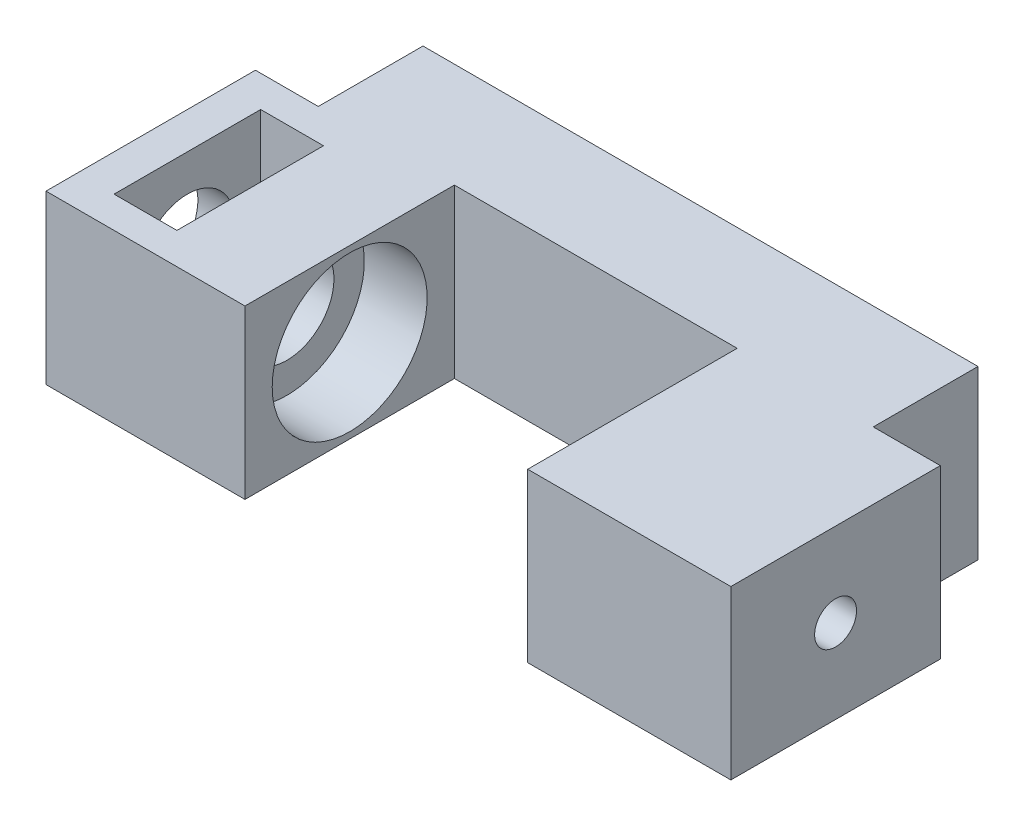
ISO-10303-21;
HEADER;
FILE_DESCRIPTION(('STEP AP214'),'2;1');
FILE_NAME('part.step','',(''),(''),'','','');
FILE_SCHEMA(('AUTOMOTIVE_DESIGN { 1 0 10303 214 1 1 1 1 }'));
ENDSEC;
DATA;
#1=APPLICATION_CONTEXT('core data for automotive mechanical design processes');
#2=APPLICATION_PROTOCOL_DEFINITION('international standard','automotive_design',2000,#1);
#3=PRODUCT_CONTEXT('',#1,'mechanical');
#4=PRODUCT('Part','Part','',(#3));
#5=PRODUCT_RELATED_PRODUCT_CATEGORY('part','',(#4));
#6=PRODUCT_DEFINITION_FORMATION('','',#4);
#7=PRODUCT_DEFINITION_CONTEXT('part definition',#1,'design');
#8=PRODUCT_DEFINITION('design','',#6,#7);
#9=PRODUCT_DEFINITION_SHAPE('','',#8);
#10=(LENGTH_UNIT() NAMED_UNIT(*) SI_UNIT(.MILLI.,.METRE.));
#11=(NAMED_UNIT(*) PLANE_ANGLE_UNIT() SI_UNIT($,.RADIAN.));
#12=(NAMED_UNIT(*) SI_UNIT($,.STERADIAN.) SOLID_ANGLE_UNIT());
#13=UNCERTAINTY_MEASURE_WITH_UNIT(LENGTH_MEASURE(1.E-05),#10,'distance_accuracy_value','');
#14=(GEOMETRIC_REPRESENTATION_CONTEXT(3) GLOBAL_UNCERTAINTY_ASSIGNED_CONTEXT((#13)) GLOBAL_UNIT_ASSIGNED_CONTEXT((#10,
#11,#12)) REPRESENTATION_CONTEXT('',''));
#15=CARTESIAN_POINT('',(0.,0.,0.));
#16=DIRECTION('',(0.,0.,1.));
#17=DIRECTION('',(1.,0.,0.));
#18=AXIS2_PLACEMENT_3D('',#15,#16,#17);
#19=CARTESIAN_POINT('',(-0.249999999999827,40.,-100.));
#20=DIRECTION('',(-1.,0.,0.));
#21=DIRECTION('',(0.,0.,1.));
#22=AXIS2_PLACEMENT_3D('',#19,#20,#21);
#23=CYLINDRICAL_SURFACE('',#22,2.25);
#24=CARTESIAN_POINT('',(-11.5,40.,-100.));
#25=DIRECTION('',(1.,0.,0.));
#26=DIRECTION('',(0.,0.,-1.));
#27=AXIS2_PLACEMENT_3D('',#24,#25,#26);
#28=CIRCLE('',#27,2.25);
#29=CARTESIAN_POINT('',(-11.5,40.,-102.25));
#30=VERTEX_POINT('',#29);
#31=EDGE_CURVE('E207',#30,#30,#28,.F.);
#32=ORIENTED_EDGE('',*,*,#31,.T.);
#33=EDGE_LOOP('',(#32));
#34=FACE_BOUND('',#33,.T.);
#35=CARTESIAN_POINT('',(-9.75000000000021,40.,-100.));
#36=DIRECTION('',(1.,0.,0.));
#37=DIRECTION('',(0.,0.,-1.));
#38=AXIS2_PLACEMENT_3D('',#35,#36,#37);
#39=CIRCLE('',#38,2.25);
#40=CARTESIAN_POINT('',(-9.75000000000021,40.,-102.25));
#41=VERTEX_POINT('',#40);
#42=EDGE_CURVE('E242',#41,#41,#39,.F.);
#43=ORIENTED_EDGE('',*,*,#42,.F.);
#44=EDGE_LOOP('',(#43));
#45=FACE_BOUND('',#44,.T.);
#46=ADVANCED_FACE('F33',(#34,#45),#23,.F.);
#47=CARTESIAN_POINT('',(-14.5,40.,-100.));
#48=DIRECTION('',(-1.,0.,0.));
#49=DIRECTION('',(0.,0.,1.));
#50=AXIS2_PLACEMENT_3D('',#47,#48,#49);
#51=CIRCLE('',#50,2.25);
#52=CARTESIAN_POINT('',(-14.5,40.,-97.75));
#53=VERTEX_POINT('',#52);
#54=EDGE_CURVE('E199',#53,#53,#51,.F.);
#55=ORIENTED_EDGE('',*,*,#54,.T.);
#56=EDGE_LOOP('',(#55));
#57=FACE_BOUND('',#56,.T.);
#58=CARTESIAN_POINT('',(-16.2499999999998,40.,-100.));
#59=DIRECTION('',(-1.,0.,0.));
#60=DIRECTION('',(0.,0.,1.));
#61=AXIS2_PLACEMENT_3D('',#58,#59,#60);
#62=CIRCLE('',#61,2.25);
#63=CARTESIAN_POINT('',(-16.2499999999998,40.,-97.75));
#64=VERTEX_POINT('',#63);
#65=EDGE_CURVE('E210',#64,#64,#62,.T.);
#66=ORIENTED_EDGE('',*,*,#65,.T.);
#67=EDGE_LOOP('',(#66));
#68=FACE_BOUND('',#67,.T.);
#69=ADVANCED_FACE('F333',(#57,#68),#23,.F.);
#70=CARTESIAN_POINT('',(-13.25,44.,-105.));
#71=DIRECTION('',(-1.,0.,0.));
#72=DIRECTION('',(0.,0.,1.));
#73=AXIS2_PLACEMENT_3D('',#70,#71,#72);
#74=PLANE('',#73);
#75=DIRECTION('',(0.,-1.,0.));
#76=VECTOR('',#75,1.);
#77=CARTESIAN_POINT('',(-13.2499999999998,44.,-105.));
#78=LINE('',#77,#76);
#79=CARTESIAN_POINT('',(-13.25,44.,-105.));
#80=VERTEX_POINT('',#79);
#81=CARTESIAN_POINT('',(-13.2499999999998,36.,-105.));
#82=VERTEX_POINT('',#81);
#83=EDGE_CURVE('E213',#80,#82,#78,.T.);
#84=ORIENTED_EDGE('',*,*,#83,.F.);
#85=DIRECTION('',(0.,0.,-1.));
#86=VECTOR('',#85,1.);
#87=CARTESIAN_POINT('',(-13.25,44.,-110.));
#88=LINE('',#87,#86);
#89=CARTESIAN_POINT('',(-13.25,44.,-110.));
#90=VERTEX_POINT('',#89);
#91=EDGE_CURVE('E266',#80,#90,#88,.T.);
#92=ORIENTED_EDGE('',*,*,#91,.T.);
#93=DIRECTION('',(0.,-1.,0.));
#94=VECTOR('',#93,1.);
#95=CARTESIAN_POINT('',(-13.25,44.,-110.));
#96=LINE('',#95,#94);
#97=CARTESIAN_POINT('',(-13.25,36.,-110.));
#98=VERTEX_POINT('',#97);
#99=EDGE_CURVE('E286',#90,#98,#96,.T.);
#100=ORIENTED_EDGE('',*,*,#99,.T.);
#101=DIRECTION('',(0.,0.,-1.));
#102=VECTOR('',#101,1.);
#103=CARTESIAN_POINT('',(-13.25,36.,-110.));
#104=LINE('',#103,#102);
#105=EDGE_CURVE('E248',#82,#98,#104,.T.);
#106=ORIENTED_EDGE('',*,*,#105,.F.);
#107=EDGE_LOOP('',(#84,#92,#100,#106));
#108=FACE_BOUND('',#107,.T.);
#109=ADVANCED_FACE('F361',(#108),#74,.T.);
#110=CARTESIAN_POINT('',(-13.25,44.,-95.));
#111=DIRECTION('',(0.,0.,1.));
#112=DIRECTION('',(1.,0.,0.));
#113=AXIS2_PLACEMENT_3D('',#110,#111,#112);
#114=PLANE('',#113);
#115=DIRECTION('',(-1.,0.,0.));
#116=VECTOR('',#115,1.);
#117=CARTESIAN_POINT('',(-13.25,44.,-95.));
#118=LINE('',#117,#116);
#119=CARTESIAN_POINT('',(-6.75,44.,-95.));
#120=VERTEX_POINT('',#119);
#121=CARTESIAN_POINT('',(-16.2499999999998,44.,-95.));
#122=VERTEX_POINT('',#121);
#123=EDGE_CURVE('E284',#120,#122,#118,.T.);
#124=ORIENTED_EDGE('',*,*,#123,.T.);
#125=DIRECTION('',(0.,1.,0.));
#126=VECTOR('',#125,1.);
#127=CARTESIAN_POINT('',(-16.2499999999998,44.,-95.));
#128=LINE('',#127,#126);
#129=CARTESIAN_POINT('',(-16.2499999999998,36.,-95.));
#130=VERTEX_POINT('',#129);
#131=EDGE_CURVE('E214',#130,#122,#128,.T.);
#132=ORIENTED_EDGE('',*,*,#131,.F.);
#133=DIRECTION('',(-1.,0.,0.));
#134=VECTOR('',#133,1.);
#135=CARTESIAN_POINT('',(-13.25,36.,-95.));
#136=LINE('',#135,#134);
#137=CARTESIAN_POINT('',(-6.75,36.,-95.));
#138=VERTEX_POINT('',#137);
#139=EDGE_CURVE('E264',#138,#130,#136,.T.);
#140=ORIENTED_EDGE('',*,*,#139,.F.);
#141=DIRECTION('',(0.,-1.,0.));
#142=VECTOR('',#141,1.);
#143=CARTESIAN_POINT('',(-6.75,44.,-95.));
#144=LINE('',#143,#142);
#145=EDGE_CURVE('E287',#120,#138,#144,.T.);
#146=ORIENTED_EDGE('',*,*,#145,.F.);
#147=EDGE_LOOP('',(#124,#132,#140,#146));
#148=FACE_BOUND('',#147,.T.);
#149=ADVANCED_FACE('F369',(#148),#114,.T.);
#150=CARTESIAN_POINT('',(-6.75,44.,-95.));
#151=DIRECTION('',(1.,0.,0.));
#152=DIRECTION('',(0.,0.,-1.));
#153=AXIS2_PLACEMENT_3D('',#150,#151,#152);
#154=PLANE('',#153);
#155=CARTESIAN_POINT('',(-6.75000000000021,40.,-100.));
#156=DIRECTION('',(-1.,0.,0.));
#157=DIRECTION('',(0.,0.,1.));
#158=AXIS2_PLACEMENT_3D('',#155,#156,#157);
#159=CIRCLE('',#158,3.7);
#160=CARTESIAN_POINT('',(-6.7500000000002,40.,-96.3));
#161=VERTEX_POINT('',#160);
#162=EDGE_CURVE('E236',#161,#161,#159,.T.);
#163=ORIENTED_EDGE('',*,*,#162,.T.);
#164=EDGE_LOOP('',(#163));
#165=FACE_BOUND('',#164,.T.);
#166=ORIENTED_EDGE('',*,*,#145,.T.);
#167=DIRECTION('',(0.,0.,1.));
#168=VECTOR('',#167,1.);
#169=CARTESIAN_POINT('',(-6.75,36.,-95.));
#170=LINE('',#169,#168);
#171=CARTESIAN_POINT('',(-6.75,36.,-105.));
#172=VERTEX_POINT('',#171);
#173=EDGE_CURVE('E261',#172,#138,#170,.T.);
#174=ORIENTED_EDGE('',*,*,#173,.F.);
#175=DIRECTION('',(0.,-1.,0.));
#176=VECTOR('',#175,1.);
#177=CARTESIAN_POINT('',(-6.75,44.,-105.));
#178=LINE('',#177,#176);
#179=CARTESIAN_POINT('',(-6.75,44.,-105.));
#180=VERTEX_POINT('',#179);
#181=EDGE_CURVE('E290',#180,#172,#178,.T.);
#182=ORIENTED_EDGE('',*,*,#181,.F.);
#183=DIRECTION('',(0.,0.,1.));
#184=VECTOR('',#183,1.);
#185=CARTESIAN_POINT('',(-6.75,44.,-95.));
#186=LINE('',#185,#184);
#187=EDGE_CURVE('E281',#180,#120,#186,.T.);
#188=ORIENTED_EDGE('',*,*,#187,.T.);
#189=EDGE_LOOP('',(#166,#174,#182,#188));
#190=FACE_BOUND('',#189,.T.);
#191=ADVANCED_FACE('F373',(#165,#190),#154,.T.);
#192=CARTESIAN_POINT('',(-6.75,44.,-105.));
#193=DIRECTION('',(0.,0.,1.));
#194=DIRECTION('',(1.,0.,0.));
#195=AXIS2_PLACEMENT_3D('',#192,#193,#194);
#196=PLANE('',#195);
#197=ORIENTED_EDGE('',*,*,#181,.T.);
#198=DIRECTION('',(-1.,0.,0.));
#199=VECTOR('',#198,1.);
#200=CARTESIAN_POINT('',(-6.75,36.,-105.));
#201=LINE('',#200,#199);
#202=CARTESIAN_POINT('',(6.75,36.,-105.));
#203=VERTEX_POINT('',#202);
#204=EDGE_CURVE('E258',#203,#172,#201,.T.);
#205=ORIENTED_EDGE('',*,*,#204,.F.);
#206=DIRECTION('',(0.,-1.,0.));
#207=VECTOR('',#206,1.);
#208=CARTESIAN_POINT('',(6.75,44.,-105.));
#209=LINE('',#208,#207);
#210=CARTESIAN_POINT('',(6.75,44.,-105.));
#211=VERTEX_POINT('',#210);
#212=EDGE_CURVE('E292',#211,#203,#209,.T.);
#213=ORIENTED_EDGE('',*,*,#212,.F.);
#214=DIRECTION('',(-1.,0.,0.));
#215=VECTOR('',#214,1.);
#216=CARTESIAN_POINT('',(-6.75,44.,-105.));
#217=LINE('',#216,#215);
#218=EDGE_CURVE('E278',#211,#180,#217,.T.);
#219=ORIENTED_EDGE('',*,*,#218,.T.);
#220=EDGE_LOOP('',(#197,#205,#213,#219));
#221=FACE_BOUND('',#220,.T.);
#222=ADVANCED_FACE('F377',(#221),#196,.T.);
#223=CARTESIAN_POINT('',(6.75,44.,-105.));
#224=DIRECTION('',(-1.,0.,0.));
#225=DIRECTION('',(0.,0.,1.));
#226=AXIS2_PLACEMENT_3D('',#223,#224,#225);
#227=PLANE('',#226);
#228=CARTESIAN_POINT('',(6.75000000000021,40.,-100.));
#229=DIRECTION('',(-1.,0.,0.));
#230=DIRECTION('',(0.,0.,1.));
#231=AXIS2_PLACEMENT_3D('',#228,#229,#230);
#232=CIRCLE('',#231,3.7);
#233=CARTESIAN_POINT('',(6.7500000000002,40.,-96.3));
#234=VERTEX_POINT('',#233);
#235=EDGE_CURVE('E249',#234,#234,#232,.T.);
#236=ORIENTED_EDGE('',*,*,#235,.F.);
#237=EDGE_LOOP('',(#236));
#238=FACE_BOUND('',#237,.T.);
#239=ORIENTED_EDGE('',*,*,#212,.T.);
#240=DIRECTION('',(0.,0.,-1.));
#241=VECTOR('',#240,1.);
#242=CARTESIAN_POINT('',(6.75,36.,-105.));
#243=LINE('',#242,#241);
#244=CARTESIAN_POINT('',(6.75,36.,-95.));
#245=VERTEX_POINT('',#244);
#246=EDGE_CURVE('E159',#245,#203,#243,.T.);
#247=ORIENTED_EDGE('',*,*,#246,.F.);
#248=DIRECTION('',(0.,-1.,0.));
#249=VECTOR('',#248,1.);
#250=CARTESIAN_POINT('',(6.75,44.,-95.));
#251=LINE('',#250,#249);
#252=CARTESIAN_POINT('',(6.75,44.,-95.));
#253=VERTEX_POINT('',#252);
#254=EDGE_CURVE('E155',#253,#245,#251,.T.);
#255=ORIENTED_EDGE('',*,*,#254,.F.);
#256=DIRECTION('',(0.,0.,-1.));
#257=VECTOR('',#256,1.);
#258=CARTESIAN_POINT('',(6.75,44.,-105.));
#259=LINE('',#258,#257);
#260=EDGE_CURVE('E275',#253,#211,#259,.T.);
#261=ORIENTED_EDGE('',*,*,#260,.T.);
#262=EDGE_LOOP('',(#239,#247,#255,#261));
#263=FACE_BOUND('',#262,.T.);
#264=ADVANCED_FACE('F381',(#238,#263),#227,.T.);
#265=CARTESIAN_POINT('',(6.75,44.,-95.));
#266=DIRECTION('',(0.,0.,1.));
#267=DIRECTION('',(1.,0.,0.));
#268=AXIS2_PLACEMENT_3D('',#265,#266,#267);
#269=PLANE('',#268);
#270=ORIENTED_EDGE('',*,*,#254,.T.);
#271=DIRECTION('',(-1.,0.,0.));
#272=VECTOR('',#271,1.);
#273=CARTESIAN_POINT('',(6.75,36.,-95.));
#274=LINE('',#273,#272);
#275=CARTESIAN_POINT('',(16.45,36.,-95.));
#276=VERTEX_POINT('',#275);
#277=EDGE_CURVE('E149',#276,#245,#274,.T.);
#278=ORIENTED_EDGE('',*,*,#277,.F.);
#279=DIRECTION('',(0.,-1.,0.));
#280=VECTOR('',#279,1.);
#281=CARTESIAN_POINT('',(16.45,36.,-95.));
#282=LINE('',#281,#280);
#283=CARTESIAN_POINT('',(16.45,44.,-95.));
#284=VERTEX_POINT('',#283);
#285=EDGE_CURVE('E154',#284,#276,#282,.T.);
#286=ORIENTED_EDGE('',*,*,#285,.F.);
#287=DIRECTION('',(-1.,0.,0.));
#288=VECTOR('',#287,1.);
#289=CARTESIAN_POINT('',(6.75,44.,-95.));
#290=LINE('',#289,#288);
#291=EDGE_CURVE('E273',#284,#253,#290,.T.);
#292=ORIENTED_EDGE('',*,*,#291,.T.);
#293=EDGE_LOOP('',(#270,#278,#286,#292));
#294=FACE_BOUND('',#293,.T.);
#295=ADVANCED_FACE('F151',(#294),#269,.T.);
#296=CARTESIAN_POINT('',(13.25,44.,-95.));
#297=DIRECTION('',(1.,0.,0.));
#298=DIRECTION('',(0.,0.,-1.));
#299=AXIS2_PLACEMENT_3D('',#296,#297,#298);
#300=PLANE('',#299);
#301=DIRECTION('',(0.,1.,0.));
#302=VECTOR('',#301,1.);
#303=CARTESIAN_POINT('',(13.25,36.,-105.));
#304=LINE('',#303,#302);
#305=CARTESIAN_POINT('',(13.25,36.,-105.));
#306=VERTEX_POINT('',#305);
#307=CARTESIAN_POINT('',(13.25,44.,-105.));
#308=VERTEX_POINT('',#307);
#309=EDGE_CURVE('E49',#306,#308,#304,.T.);
#310=ORIENTED_EDGE('',*,*,#309,.F.);
#311=DIRECTION('',(0.,0.,1.));
#312=VECTOR('',#311,1.);
#313=CARTESIAN_POINT('',(13.25,36.,-105.));
#314=LINE('',#313,#312);
#315=CARTESIAN_POINT('',(13.25,36.,-110.));
#316=VERTEX_POINT('',#315);
#317=EDGE_CURVE('E160',#316,#306,#314,.T.);
#318=ORIENTED_EDGE('',*,*,#317,.F.);
#319=DIRECTION('',(0.,-1.,0.));
#320=VECTOR('',#319,1.);
#321=CARTESIAN_POINT('',(13.25,44.,-110.));
#322=LINE('',#321,#320);
#323=CARTESIAN_POINT('',(13.25,44.,-110.));
#324=VERTEX_POINT('',#323);
#325=EDGE_CURVE('E295',#324,#316,#322,.T.);
#326=ORIENTED_EDGE('',*,*,#325,.F.);
#327=DIRECTION('',(0.,0.,1.));
#328=VECTOR('',#327,1.);
#329=CARTESIAN_POINT('',(13.25,44.,-105.));
#330=LINE('',#329,#328);
#331=EDGE_CURVE('E271',#324,#308,#330,.T.);
#332=ORIENTED_EDGE('',*,*,#331,.T.);
#333=EDGE_LOOP('',(#310,#318,#326,#332));
#334=FACE_BOUND('',#333,.T.);
#335=ADVANCED_FACE('F387',(#334),#300,.T.);
#336=CARTESIAN_POINT('',(13.25,44.,-110.));
#337=DIRECTION('',(0.,0.,-1.));
#338=DIRECTION('',(-1.,0.,0.));
#339=AXIS2_PLACEMENT_3D('',#336,#337,#338);
#340=PLANE('',#339);
#341=ORIENTED_EDGE('',*,*,#325,.T.);
#342=DIRECTION('',(1.,0.,0.));
#343=VECTOR('',#342,1.);
#344=CARTESIAN_POINT('',(13.25,36.,-110.));
#345=LINE('',#344,#343);
#346=EDGE_CURVE('E253',#98,#316,#345,.T.);
#347=ORIENTED_EDGE('',*,*,#346,.F.);
#348=ORIENTED_EDGE('',*,*,#99,.F.);
#349=DIRECTION('',(1.,0.,0.));
#350=VECTOR('',#349,1.);
#351=CARTESIAN_POINT('',(13.25,44.,-110.));
#352=LINE('',#351,#350);
#353=EDGE_CURVE('E268',#90,#324,#352,.T.);
#354=ORIENTED_EDGE('',*,*,#353,.T.);
#355=EDGE_LOOP('',(#341,#347,#348,#354));
#356=FACE_BOUND('',#355,.T.);
#357=ADVANCED_FACE('F35',(#356),#340,.T.);
#358=CARTESIAN_POINT('',(0.,44.,0.));
#359=DIRECTION('',(0.,1.,0.));
#360=DIRECTION('',(0.,0.,1.));
#361=AXIS2_PLACEMENT_3D('',#358,#359,#360);
#362=PLANE('',#361);
#363=DIRECTION('',(0.,0.,-1.));
#364=VECTOR('',#363,1.);
#365=CARTESIAN_POINT('',(-11.5,44.,-96.5));
#366=LINE('',#365,#364);
#367=CARTESIAN_POINT('',(-11.5,44.,-96.5));
#368=VERTEX_POINT('',#367);
#369=CARTESIAN_POINT('',(-11.5,44.,-103.5));
#370=VERTEX_POINT('',#369);
#371=EDGE_CURVE('E57',#368,#370,#366,.T.);
#372=ORIENTED_EDGE('',*,*,#371,.F.);
#373=DIRECTION('',(1.,0.,0.));
#374=VECTOR('',#373,1.);
#375=CARTESIAN_POINT('',(-14.5,44.,-96.5));
#376=LINE('',#375,#374);
#377=CARTESIAN_POINT('',(-14.5,44.,-96.5));
#378=VERTEX_POINT('',#377);
#379=EDGE_CURVE('E193',#378,#368,#376,.T.);
#380=ORIENTED_EDGE('',*,*,#379,.F.);
#381=DIRECTION('',(0.,0.,1.));
#382=VECTOR('',#381,1.);
#383=CARTESIAN_POINT('',(-14.5,44.,-96.5));
#384=LINE('',#383,#382);
#385=CARTESIAN_POINT('',(-14.5,44.,-103.5));
#386=VERTEX_POINT('',#385);
#387=EDGE_CURVE('E190',#386,#378,#384,.T.);
#388=ORIENTED_EDGE('',*,*,#387,.F.);
#389=DIRECTION('',(-1.,0.,0.));
#390=VECTOR('',#389,1.);
#391=CARTESIAN_POINT('',(-14.5,44.,-103.5));
#392=LINE('',#391,#390);
#393=EDGE_CURVE('E187',#370,#386,#392,.T.);
#394=ORIENTED_EDGE('',*,*,#393,.F.);
#395=EDGE_LOOP('',(#372,#380,#388,#394));
#396=FACE_BOUND('',#395,.T.);
#397=ORIENTED_EDGE('',*,*,#91,.F.);
#398=DIRECTION('',(1.,0.,0.));
#399=VECTOR('',#398,1.);
#400=CARTESIAN_POINT('',(-16.2499999999998,44.,-105.));
#401=LINE('',#400,#399);
#402=CARTESIAN_POINT('',(-16.2499999999998,44.,-105.));
#403=VERTEX_POINT('',#402);
#404=EDGE_CURVE('E229',#403,#80,#401,.T.);
#405=ORIENTED_EDGE('',*,*,#404,.F.);
#406=DIRECTION('',(0.,0.,-1.));
#407=VECTOR('',#406,1.);
#408=CARTESIAN_POINT('',(-16.2499999999998,44.,-95.));
#409=LINE('',#408,#407);
#410=EDGE_CURVE('E217',#122,#403,#409,.T.);
#411=ORIENTED_EDGE('',*,*,#410,.F.);
#412=ORIENTED_EDGE('',*,*,#123,.F.);
#413=ORIENTED_EDGE('',*,*,#187,.F.);
#414=ORIENTED_EDGE('',*,*,#218,.F.);
#415=ORIENTED_EDGE('',*,*,#260,.F.);
#416=ORIENTED_EDGE('',*,*,#291,.F.);
#417=DIRECTION('',(0.,0.,1.));
#418=VECTOR('',#417,1.);
#419=CARTESIAN_POINT('',(16.45,44.,-105.));
#420=LINE('',#419,#418);
#421=CARTESIAN_POINT('',(16.45,44.,-105.));
#422=VERTEX_POINT('',#421);
#423=EDGE_CURVE('E174',#422,#284,#420,.T.);
#424=ORIENTED_EDGE('',*,*,#423,.F.);
#425=DIRECTION('',(-1.,0.,0.));
#426=VECTOR('',#425,1.);
#427=CARTESIAN_POINT('',(16.45,44.,-105.));
#428=LINE('',#427,#426);
#429=EDGE_CURVE('E181',#422,#308,#428,.T.);
#430=ORIENTED_EDGE('',*,*,#429,.T.);
#431=ORIENTED_EDGE('',*,*,#331,.F.);
#432=ORIENTED_EDGE('',*,*,#353,.F.);
#433=EDGE_LOOP('',(#397,#405,#411,#412,#413,#414,#415,#416,#424,#430,#431,#432));
#434=FACE_BOUND('',#433,.T.);
#435=ADVANCED_FACE('F320',(#396,#434),#362,.T.);
#436=CARTESIAN_POINT('',(0.,36.,0.));
#437=DIRECTION('',(0.,1.,0.));
#438=DIRECTION('',(0.,0.,1.));
#439=AXIS2_PLACEMENT_3D('',#436,#437,#438);
#440=PLANE('',#439);
#441=DIRECTION('',(1.,0.,0.));
#442=VECTOR('',#441,1.);
#443=CARTESIAN_POINT('',(0.,36.,-96.5));
#444=LINE('',#443,#442);
#445=CARTESIAN_POINT('',(-14.5,36.,-96.5));
#446=VERTEX_POINT('',#445);
#447=CARTESIAN_POINT('',(-11.5,36.,-96.5));
#448=VERTEX_POINT('',#447);
#449=EDGE_CURVE('E42',#446,#448,#444,.T.);
#450=ORIENTED_EDGE('',*,*,#449,.T.);
#451=DIRECTION('',(0.,0.,-1.));
#452=VECTOR('',#451,1.);
#453=CARTESIAN_POINT('',(-11.5,36.,0.));
#454=LINE('',#453,#452);
#455=CARTESIAN_POINT('',(-11.5,36.,-103.5));
#456=VERTEX_POINT('',#455);
#457=EDGE_CURVE('E11',#448,#456,#454,.T.);
#458=ORIENTED_EDGE('',*,*,#457,.T.);
#459=DIRECTION('',(-1.,0.,0.));
#460=VECTOR('',#459,1.);
#461=CARTESIAN_POINT('',(0.,36.,-103.5));
#462=LINE('',#461,#460);
#463=CARTESIAN_POINT('',(-14.5,36.,-103.5));
#464=VERTEX_POINT('',#463);
#465=EDGE_CURVE('E289',#456,#464,#462,.T.);
#466=ORIENTED_EDGE('',*,*,#465,.T.);
#467=DIRECTION('',(0.,0.,1.));
#468=VECTOR('',#467,1.);
#469=CARTESIAN_POINT('',(-14.5,36.,0.));
#470=LINE('',#469,#468);
#471=EDGE_CURVE('E303',#464,#446,#470,.T.);
#472=ORIENTED_EDGE('',*,*,#471,.T.);
#473=EDGE_LOOP('',(#450,#458,#466,#472));
#474=FACE_BOUND('',#473,.T.);
#475=ORIENTED_EDGE('',*,*,#139,.T.);
#476=DIRECTION('',(0.,0.,1.));
#477=VECTOR('',#476,1.);
#478=CARTESIAN_POINT('',(-16.2499999999998,36.,-95.));
#479=LINE('',#478,#477);
#480=CARTESIAN_POINT('',(-16.2499999999998,36.,-105.));
#481=VERTEX_POINT('',#480);
#482=EDGE_CURVE('E221',#481,#130,#479,.T.);
#483=ORIENTED_EDGE('',*,*,#482,.F.);
#484=DIRECTION('',(1.,0.,0.));
#485=VECTOR('',#484,1.);
#486=CARTESIAN_POINT('',(-16.2499999999998,36.,-105.));
#487=LINE('',#486,#485);
#488=EDGE_CURVE('E224',#481,#82,#487,.T.);
#489=ORIENTED_EDGE('',*,*,#488,.T.);
#490=ORIENTED_EDGE('',*,*,#105,.T.);
#491=ORIENTED_EDGE('',*,*,#346,.T.);
#492=ORIENTED_EDGE('',*,*,#317,.T.);
#493=DIRECTION('',(-1.,0.,0.));
#494=VECTOR('',#493,1.);
#495=CARTESIAN_POINT('',(16.45,36.,-105.));
#496=LINE('',#495,#494);
#497=CARTESIAN_POINT('',(16.45,36.,-105.));
#498=VERTEX_POINT('',#497);
#499=EDGE_CURVE('E166',#498,#306,#496,.T.);
#500=ORIENTED_EDGE('',*,*,#499,.F.);
#501=DIRECTION('',(0.,0.,-1.));
#502=VECTOR('',#501,1.);
#503=CARTESIAN_POINT('',(16.45,36.,-105.));
#504=LINE('',#503,#502);
#505=EDGE_CURVE('E163',#276,#498,#504,.T.);
#506=ORIENTED_EDGE('',*,*,#505,.F.);
#507=ORIENTED_EDGE('',*,*,#277,.T.);
#508=ORIENTED_EDGE('',*,*,#246,.T.);
#509=ORIENTED_EDGE('',*,*,#204,.T.);
#510=ORIENTED_EDGE('',*,*,#173,.T.);
#511=EDGE_LOOP('',(#475,#483,#489,#490,#491,#492,#500,#506,#507,#508,#509,#510));
#512=FACE_BOUND('',#511,.T.);
#513=ADVANCED_FACE('F164',(#474,#512),#440,.F.);
#514=CARTESIAN_POINT('',(9.75000000000021,40.,-100.));
#515=DIRECTION('',(-1.,0.,0.));
#516=DIRECTION('',(0.,0.,1.));
#517=AXIS2_PLACEMENT_3D('',#514,#515,#516);
#518=CYLINDRICAL_SURFACE('',#517,3.7);
#519=CARTESIAN_POINT('',(9.75000000000021,40.,-100.));
#520=DIRECTION('',(-1.,0.,0.));
#521=DIRECTION('',(0.,0.,1.));
#522=AXIS2_PLACEMENT_3D('',#519,#520,#521);
#523=CIRCLE('',#522,3.7);
#524=CARTESIAN_POINT('',(9.7500000000002,40.,-96.3));
#525=VERTEX_POINT('',#524);
#526=EDGE_CURVE('E245',#525,#525,#523,.T.);
#527=ORIENTED_EDGE('',*,*,#526,.F.);
#528=EDGE_LOOP('',(#527));
#529=FACE_BOUND('',#528,.T.);
#530=ORIENTED_EDGE('',*,*,#235,.T.);
#531=EDGE_LOOP('',(#530));
#532=FACE_BOUND('',#531,.T.);
#533=ADVANCED_FACE('F350',(#529,#532),#518,.F.);
#534=CARTESIAN_POINT('',(9.75000000000021,40.,-100.));
#535=DIRECTION('',(-1.,0.,0.));
#536=DIRECTION('',(0.,0.,1.));
#537=AXIS2_PLACEMENT_3D('',#534,#535,#536);
#538=PLANE('',#537);
#539=CARTESIAN_POINT('',(9.75000000000021,40.,-100.));
#540=DIRECTION('',(-1.,0.,0.));
#541=DIRECTION('',(0.,0.,1.));
#542=AXIS2_PLACEMENT_3D('',#539,#540,#541);
#543=CIRCLE('',#542,2.2);
#544=CARTESIAN_POINT('',(9.75000000000021,40.,-97.8));
#545=VERTEX_POINT('',#544);
#546=EDGE_CURVE('E232',#545,#545,#543,.T.);
#547=ORIENTED_EDGE('',*,*,#546,.F.);
#548=EDGE_LOOP('',(#547));
#549=FACE_BOUND('',#548,.T.);
#550=ORIENTED_EDGE('',*,*,#526,.T.);
#551=EDGE_LOOP('',(#550));
#552=FACE_BOUND('',#551,.T.);
#553=ADVANCED_FACE('F340',(#549,#552),#538,.T.);
#554=CARTESIAN_POINT('',(-9.75000000000021,40.,-100.));
#555=DIRECTION('',(1.,0.,0.));
#556=DIRECTION('',(0.,0.,1.));
#557=AXIS2_PLACEMENT_3D('',#554,#555,#556);
#558=PLANE('',#557);
#559=CARTESIAN_POINT('',(-9.75000000000021,40.,-100.));
#560=DIRECTION('',(-1.,0.,0.));
#561=DIRECTION('',(0.,0.,1.));
#562=AXIS2_PLACEMENT_3D('',#559,#560,#561);
#563=CIRCLE('',#562,3.7);
#564=CARTESIAN_POINT('',(-9.7500000000002,40.,-96.3));
#565=VERTEX_POINT('',#564);
#566=EDGE_CURVE('E239',#565,#565,#563,.T.);
#567=ORIENTED_EDGE('',*,*,#566,.F.);
#568=EDGE_LOOP('',(#567));
#569=FACE_BOUND('',#568,.T.);
#570=ORIENTED_EDGE('',*,*,#42,.T.);
#571=EDGE_LOOP('',(#570));
#572=FACE_BOUND('',#571,.T.);
#573=ADVANCED_FACE('F337',(#569,#572),#558,.T.);
#574=CARTESIAN_POINT('',(-9.75000000000021,40.,-100.));
#575=DIRECTION('',(1.,0.,0.));
#576=DIRECTION('',(0.,0.,-1.));
#577=AXIS2_PLACEMENT_3D('',#574,#575,#576);
#578=CYLINDRICAL_SURFACE('',#577,3.7);
#579=ORIENTED_EDGE('',*,*,#566,.T.);
#580=EDGE_LOOP('',(#579));
#581=FACE_BOUND('',#580,.T.);
#582=ORIENTED_EDGE('',*,*,#162,.F.);
#583=EDGE_LOOP('',(#582));
#584=FACE_BOUND('',#583,.T.);
#585=ADVANCED_FACE('F339',(#581,#584),#578,.F.);
#586=CARTESIAN_POINT('',(10.7500000000002,40.,-100.));
#587=DIRECTION('',(-1.,0.,0.));
#588=DIRECTION('',(0.,0.,1.));
#589=AXIS2_PLACEMENT_3D('',#586,#587,#588);
#590=CYLINDRICAL_SURFACE('',#589,2.2);
#591=CARTESIAN_POINT('',(10.7500000000002,40.,-100.));
#592=DIRECTION('',(-1.,0.,0.));
#593=DIRECTION('',(0.,0.,1.));
#594=AXIS2_PLACEMENT_3D('',#591,#592,#593);
#595=CIRCLE('',#594,2.2);
#596=CARTESIAN_POINT('',(10.7500000000002,40.,-97.8));
#597=VERTEX_POINT('',#596);
#598=EDGE_CURVE('E233',#597,#597,#595,.T.);
#599=ORIENTED_EDGE('',*,*,#598,.F.);
#600=EDGE_LOOP('',(#599));
#601=FACE_BOUND('',#600,.T.);
#602=ORIENTED_EDGE('',*,*,#546,.T.);
#603=EDGE_LOOP('',(#602));
#604=FACE_BOUND('',#603,.T.);
#605=ADVANCED_FACE('F347',(#601,#604),#590,.F.);
#606=CARTESIAN_POINT('',(10.7500000000002,40.,-100.));
#607=DIRECTION('',(-1.,0.,0.));
#608=DIRECTION('',(0.,0.,1.));
#609=AXIS2_PLACEMENT_3D('',#606,#607,#608);
#610=PLANE('',#609);
#611=CARTESIAN_POINT('',(10.7500000000002,40.,-100.));
#612=DIRECTION('',(-1.,0.,0.));
#613=DIRECTION('',(0.,0.,1.));
#614=AXIS2_PLACEMENT_3D('',#611,#612,#613);
#615=CIRCLE('',#614,0.999999999999998);
#616=CARTESIAN_POINT('',(10.7500000000002,40.,-99.));
#617=VERTEX_POINT('',#616);
#618=EDGE_CURVE('E178',#617,#617,#615,.T.);
#619=ORIENTED_EDGE('',*,*,#618,.F.);
#620=EDGE_LOOP('',(#619));
#621=FACE_BOUND('',#620,.T.);
#622=ORIENTED_EDGE('',*,*,#598,.T.);
#623=EDGE_LOOP('',(#622));
#624=FACE_BOUND('',#623,.T.);
#625=ADVANCED_FACE('F427',(#621,#624),#610,.T.);
#626=CARTESIAN_POINT('',(-16.25,0.,0.));
#627=DIRECTION('',(1.,0.,0.));
#628=DIRECTION('',(0.,0.,-1.));
#629=AXIS2_PLACEMENT_3D('',#626,#627,#628);
#630=PLANE('',#629);
#631=ORIENTED_EDGE('',*,*,#131,.T.);
#632=ORIENTED_EDGE('',*,*,#410,.T.);
#633=DIRECTION('',(0.,-1.,0.));
#634=VECTOR('',#633,1.);
#635=CARTESIAN_POINT('',(-16.2499999999998,44.,-105.));
#636=LINE('',#635,#634);
#637=EDGE_CURVE('E219',#403,#481,#636,.T.);
#638=ORIENTED_EDGE('',*,*,#637,.T.);
#639=ORIENTED_EDGE('',*,*,#482,.T.);
#640=EDGE_LOOP('',(#631,#632,#638,#639));
#641=FACE_BOUND('',#640,.T.);
#642=ORIENTED_EDGE('',*,*,#65,.F.);
#643=EDGE_LOOP('',(#642));
#644=FACE_BOUND('',#643,.T.);
#645=ADVANCED_FACE('F418',(#641,#644),#630,.F.);
#646=CARTESIAN_POINT('',(-16.2499999999998,44.,-105.));
#647=DIRECTION('',(0.,0.,1.));
#648=DIRECTION('',(1.,0.,0.));
#649=AXIS2_PLACEMENT_3D('',#646,#647,#648);
#650=PLANE('',#649);
#651=ORIENTED_EDGE('',*,*,#83,.T.);
#652=ORIENTED_EDGE('',*,*,#488,.F.);
#653=ORIENTED_EDGE('',*,*,#637,.F.);
#654=ORIENTED_EDGE('',*,*,#404,.T.);
#655=EDGE_LOOP('',(#651,#652,#653,#654));
#656=FACE_BOUND('',#655,.T.);
#657=ADVANCED_FACE('F327',(#656),#650,.F.);
#658=CARTESIAN_POINT('',(-11.5,34.,-96.5));
#659=DIRECTION('',(1.,0.,0.));
#660=DIRECTION('',(0.,0.,-1.));
#661=AXIS2_PLACEMENT_3D('',#658,#659,#660);
#662=PLANE('',#661);
#663=DIRECTION('',(0.,1.,0.));
#664=VECTOR('',#663,1.);
#665=CARTESIAN_POINT('',(-11.5,34.,-96.5));
#666=LINE('',#665,#664);
#667=EDGE_CURVE('E197',#448,#368,#666,.T.);
#668=ORIENTED_EDGE('',*,*,#667,.T.);
#669=ORIENTED_EDGE('',*,*,#371,.T.);
#670=DIRECTION('',(0.,1.,0.));
#671=VECTOR('',#670,1.);
#672=CARTESIAN_POINT('',(-11.5,34.,-103.5));
#673=LINE('',#672,#671);
#674=EDGE_CURVE('E196',#456,#370,#673,.T.);
#675=ORIENTED_EDGE('',*,*,#674,.F.);
#676=ORIENTED_EDGE('',*,*,#457,.F.);
#677=EDGE_LOOP('',(#668,#669,#675,#676));
#678=FACE_BOUND('',#677,.T.);
#679=ORIENTED_EDGE('',*,*,#31,.F.);
#680=EDGE_LOOP('',(#679));
#681=FACE_BOUND('',#680,.T.);
#682=ADVANCED_FACE('F324',(#678,#681),#662,.F.);
#683=CARTESIAN_POINT('',(-14.5,34.,-96.5));
#684=DIRECTION('',(0.,0.,1.));
#685=DIRECTION('',(1.,0.,0.));
#686=AXIS2_PLACEMENT_3D('',#683,#684,#685);
#687=PLANE('',#686);
#688=DIRECTION('',(0.,1.,0.));
#689=VECTOR('',#688,1.);
#690=CARTESIAN_POINT('',(-14.5,34.,-96.5));
#691=LINE('',#690,#689);
#692=EDGE_CURVE('E200',#446,#378,#691,.T.);
#693=ORIENTED_EDGE('',*,*,#692,.T.);
#694=ORIENTED_EDGE('',*,*,#379,.T.);
#695=ORIENTED_EDGE('',*,*,#667,.F.);
#696=ORIENTED_EDGE('',*,*,#449,.F.);
#697=EDGE_LOOP('',(#693,#694,#695,#696));
#698=FACE_BOUND('',#697,.T.);
#699=ADVANCED_FACE('F312',(#698),#687,.F.);
#700=CARTESIAN_POINT('',(-14.5,34.,-96.5));
#701=DIRECTION('',(-1.,0.,0.));
#702=DIRECTION('',(0.,0.,1.));
#703=AXIS2_PLACEMENT_3D('',#700,#701,#702);
#704=PLANE('',#703);
#705=DIRECTION('',(0.,1.,0.));
#706=VECTOR('',#705,1.);
#707=CARTESIAN_POINT('',(-14.5,34.,-103.5));
#708=LINE('',#707,#706);
#709=EDGE_CURVE('E202',#464,#386,#708,.T.);
#710=ORIENTED_EDGE('',*,*,#709,.T.);
#711=ORIENTED_EDGE('',*,*,#387,.T.);
#712=ORIENTED_EDGE('',*,*,#692,.F.);
#713=ORIENTED_EDGE('',*,*,#471,.F.);
#714=EDGE_LOOP('',(#710,#711,#712,#713));
#715=FACE_BOUND('',#714,.T.);
#716=ORIENTED_EDGE('',*,*,#54,.F.);
#717=EDGE_LOOP('',(#716));
#718=FACE_BOUND('',#717,.T.);
#719=ADVANCED_FACE('F314',(#715,#718),#704,.F.);
#720=CARTESIAN_POINT('',(-14.5,34.,-103.5));
#721=DIRECTION('',(0.,0.,-1.));
#722=DIRECTION('',(-1.,0.,0.));
#723=AXIS2_PLACEMENT_3D('',#720,#721,#722);
#724=PLANE('',#723);
#725=ORIENTED_EDGE('',*,*,#674,.T.);
#726=ORIENTED_EDGE('',*,*,#393,.T.);
#727=ORIENTED_EDGE('',*,*,#709,.F.);
#728=ORIENTED_EDGE('',*,*,#465,.F.);
#729=EDGE_LOOP('',(#725,#726,#727,#728));
#730=FACE_BOUND('',#729,.T.);
#731=ADVANCED_FACE('F323',(#730),#724,.F.);
#732=CARTESIAN_POINT('',(16.45,36.,-105.));
#733=DIRECTION('',(0.,0.,1.));
#734=DIRECTION('',(1.,0.,0.));
#735=AXIS2_PLACEMENT_3D('',#732,#733,#734);
#736=PLANE('',#735);
#737=ORIENTED_EDGE('',*,*,#309,.T.);
#738=ORIENTED_EDGE('',*,*,#429,.F.);
#739=DIRECTION('',(0.,1.,0.));
#740=VECTOR('',#739,1.);
#741=CARTESIAN_POINT('',(16.45,36.,-105.));
#742=LINE('',#741,#740);
#743=EDGE_CURVE('E169',#498,#422,#742,.T.);
#744=ORIENTED_EDGE('',*,*,#743,.F.);
#745=ORIENTED_EDGE('',*,*,#499,.T.);
#746=EDGE_LOOP('',(#737,#738,#744,#745));
#747=FACE_BOUND('',#746,.T.);
#748=ADVANCED_FACE('F405',(#747),#736,.F.);
#749=CARTESIAN_POINT('',(16.45,0.,0.));
#750=DIRECTION('',(1.,0.,0.));
#751=DIRECTION('',(0.,0.,-1.));
#752=AXIS2_PLACEMENT_3D('',#749,#750,#751);
#753=PLANE('',#752);
#754=CARTESIAN_POINT('',(16.45,40.,-100.));
#755=DIRECTION('',(1.,0.,0.));
#756=DIRECTION('',(0.,0.,-1.));
#757=AXIS2_PLACEMENT_3D('',#754,#755,#756);
#758=CIRCLE('',#757,0.999999999999998);
#759=CARTESIAN_POINT('',(16.45,40.,-101.));
#760=VERTEX_POINT('',#759);
#761=EDGE_CURVE('E37',#760,#760,#758,.T.);
#762=ORIENTED_EDGE('',*,*,#761,.F.);
#763=EDGE_LOOP('',(#762));
#764=FACE_BOUND('',#763,.T.);
#765=ORIENTED_EDGE('',*,*,#285,.T.);
#766=ORIENTED_EDGE('',*,*,#505,.T.);
#767=ORIENTED_EDGE('',*,*,#743,.T.);
#768=ORIENTED_EDGE('',*,*,#423,.T.);
#769=EDGE_LOOP('',(#765,#766,#767,#768));
#770=FACE_BOUND('',#769,.T.);
#771=ADVANCED_FACE('F172',(#764,#770),#753,.T.);
#772=CARTESIAN_POINT('',(20.7500000000002,40.,-100.));
#773=DIRECTION('',(-1.,0.,0.));
#774=DIRECTION('',(0.,0.,1.));
#775=AXIS2_PLACEMENT_3D('',#772,#773,#774);
#776=CYLINDRICAL_SURFACE('',#775,0.999999999999998);
#777=ORIENTED_EDGE('',*,*,#761,.T.);
#778=EDGE_LOOP('',(#777));
#779=FACE_BOUND('',#778,.T.);
#780=ORIENTED_EDGE('',*,*,#618,.T.);
#781=EDGE_LOOP('',(#780));
#782=FACE_BOUND('',#781,.T.);
#783=ADVANCED_FACE('F449',(#779,#782),#776,.F.);
#784=CLOSED_SHELL('',(#46,#69,#109,#149,#191,#222,#264,#295,#335,#357,#435,#513,#533,#553,#573,
#585,#605,#625,#645,#657,#682,#699,#719,#731,#748,#771,#783));
#785=MANIFOLD_SOLID_BREP('B2',#784);
#786=ADVANCED_BREP_SHAPE_REPRESENTATION('',(#18,#785),#14);
#787=SHAPE_DEFINITION_REPRESENTATION(#9,#786);
ENDSEC;
END-ISO-10303-21;
